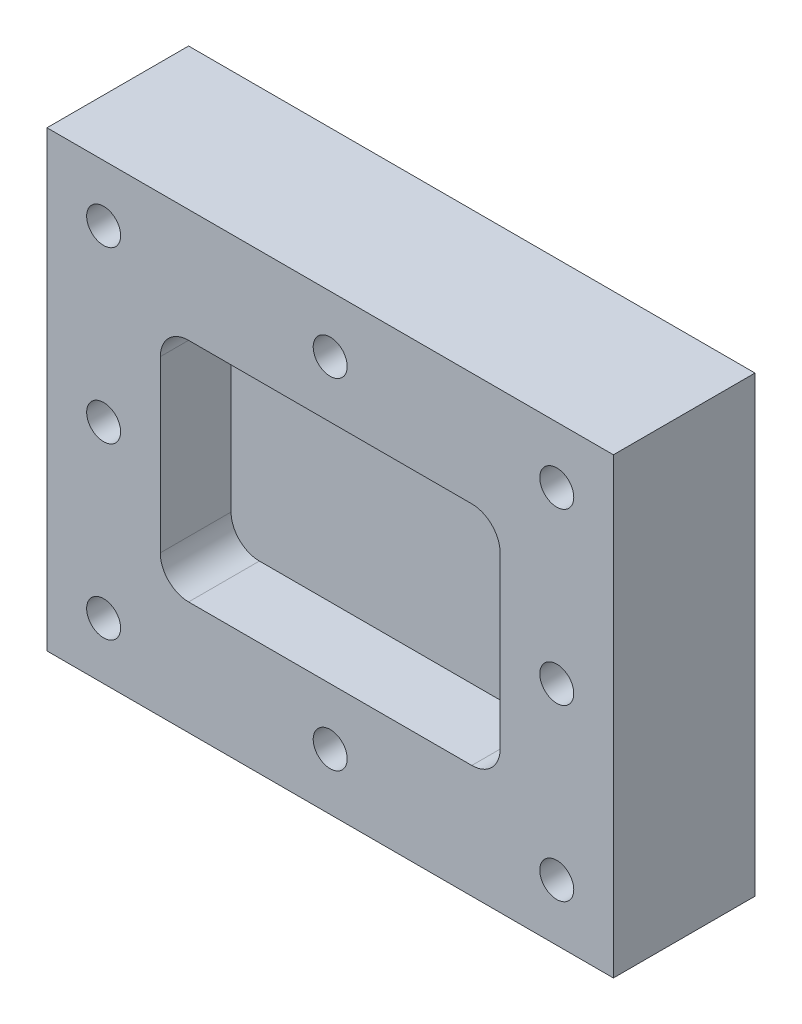
ISO-10303-21;
HEADER;
FILE_DESCRIPTION(('STEP AP214'),'2;1');
FILE_NAME('part.step','',(''),(''),'','','');
FILE_SCHEMA(('AUTOMOTIVE_DESIGN { 1 0 10303 214 1 1 1 1 }'));
ENDSEC;
DATA;
#1=APPLICATION_CONTEXT('core data for automotive mechanical design processes');
#2=APPLICATION_PROTOCOL_DEFINITION('international standard','automotive_design',2000,#1);
#3=PRODUCT_CONTEXT('',#1,'mechanical');
#4=PRODUCT('Part','Part','',(#3));
#5=PRODUCT_RELATED_PRODUCT_CATEGORY('part','',(#4));
#6=PRODUCT_DEFINITION_FORMATION('','',#4);
#7=PRODUCT_DEFINITION_CONTEXT('part definition',#1,'design');
#8=PRODUCT_DEFINITION('design','',#6,#7);
#9=PRODUCT_DEFINITION_SHAPE('','',#8);
#10=(LENGTH_UNIT() NAMED_UNIT(*) SI_UNIT(.MILLI.,.METRE.));
#11=(NAMED_UNIT(*) PLANE_ANGLE_UNIT() SI_UNIT($,.RADIAN.));
#12=(NAMED_UNIT(*) SI_UNIT($,.STERADIAN.) SOLID_ANGLE_UNIT());
#13=UNCERTAINTY_MEASURE_WITH_UNIT(LENGTH_MEASURE(1.E-05),#10,'distance_accuracy_value','');
#14=(GEOMETRIC_REPRESENTATION_CONTEXT(3) GLOBAL_UNCERTAINTY_ASSIGNED_CONTEXT((#13)) GLOBAL_UNIT_ASSIGNED_CONTEXT((#10,
#11,#12)) REPRESENTATION_CONTEXT('',''));
#15=CARTESIAN_POINT('',(0.,0.,0.));
#16=DIRECTION('',(0.,0.,1.));
#17=DIRECTION('',(1.,0.,0.));
#18=AXIS2_PLACEMENT_3D('',#15,#16,#17);
#19=CARTESIAN_POINT('',(-100.,-80.,0.));
#20=DIRECTION('',(0.,0.,-1.));
#21=DIRECTION('',(-1.,0.,0.));
#22=AXIS2_PLACEMENT_3D('',#19,#20,#21);
#23=PLANE('',#22);
#24=CARTESIAN_POINT('',(0.,60.,0.));
#25=DIRECTION('',(0.,0.,1.));
#26=DIRECTION('',(1.,0.,0.));
#27=AXIS2_PLACEMENT_3D('',#24,#25,#26);
#28=CIRCLE('',#27,6.);
#29=CARTESIAN_POINT('',(6.,60.,0.));
#30=VERTEX_POINT('',#29);
#31=EDGE_CURVE('E322',#30,#30,#28,.T.);
#32=ORIENTED_EDGE('',*,*,#31,.F.);
#33=EDGE_LOOP('',(#32));
#34=FACE_BOUND('',#33,.T.);
#35=CARTESIAN_POINT('',(0.,-60.,0.));
#36=DIRECTION('',(0.,0.,1.));
#37=DIRECTION('',(1.,0.,0.));
#38=AXIS2_PLACEMENT_3D('',#35,#36,#37);
#39=CIRCLE('',#38,6.);
#40=CARTESIAN_POINT('',(6.,-60.,0.));
#41=VERTEX_POINT('',#40);
#42=EDGE_CURVE('E318',#41,#41,#39,.T.);
#43=ORIENTED_EDGE('',*,*,#42,.F.);
#44=EDGE_LOOP('',(#43));
#45=FACE_BOUND('',#44,.T.);
#46=CARTESIAN_POINT('',(80.0000000000001,60.,0.));
#47=DIRECTION('',(0.,0.,1.));
#48=DIRECTION('',(1.,0.,0.));
#49=AXIS2_PLACEMENT_3D('',#46,#47,#48);
#50=CIRCLE('',#49,6.);
#51=CARTESIAN_POINT('',(86.0000000000001,60.,0.));
#52=VERTEX_POINT('',#51);
#53=EDGE_CURVE('E314',#52,#52,#50,.T.);
#54=ORIENTED_EDGE('',*,*,#53,.F.);
#55=EDGE_LOOP('',(#54));
#56=FACE_BOUND('',#55,.T.);
#57=CARTESIAN_POINT('',(80.,0.,0.));
#58=DIRECTION('',(0.,0.,1.));
#59=DIRECTION('',(1.,0.,0.));
#60=AXIS2_PLACEMENT_3D('',#57,#58,#59);
#61=CIRCLE('',#60,6.);
#62=CARTESIAN_POINT('',(86.,0.,0.));
#63=VERTEX_POINT('',#62);
#64=EDGE_CURVE('E310',#63,#63,#61,.T.);
#65=ORIENTED_EDGE('',*,*,#64,.F.);
#66=EDGE_LOOP('',(#65));
#67=FACE_BOUND('',#66,.T.);
#68=CARTESIAN_POINT('',(80.,-60.,0.));
#69=DIRECTION('',(0.,0.,1.));
#70=DIRECTION('',(1.,0.,0.));
#71=AXIS2_PLACEMENT_3D('',#68,#69,#70);
#72=CIRCLE('',#71,6.);
#73=CARTESIAN_POINT('',(86.,-60.,0.));
#74=VERTEX_POINT('',#73);
#75=EDGE_CURVE('E306',#74,#74,#72,.T.);
#76=ORIENTED_EDGE('',*,*,#75,.F.);
#77=EDGE_LOOP('',(#76));
#78=FACE_BOUND('',#77,.T.);
#79=CARTESIAN_POINT('',(-80.,-60.,0.));
#80=DIRECTION('',(0.,0.,1.));
#81=DIRECTION('',(1.,0.,0.));
#82=AXIS2_PLACEMENT_3D('',#79,#80,#81);
#83=CIRCLE('',#82,6.);
#84=CARTESIAN_POINT('',(-74.,-60.,0.));
#85=VERTEX_POINT('',#84);
#86=EDGE_CURVE('E302',#85,#85,#83,.T.);
#87=ORIENTED_EDGE('',*,*,#86,.F.);
#88=EDGE_LOOP('',(#87));
#89=FACE_BOUND('',#88,.T.);
#90=CARTESIAN_POINT('',(-80.,0.,0.));
#91=DIRECTION('',(0.,0.,1.));
#92=DIRECTION('',(1.,0.,0.));
#93=AXIS2_PLACEMENT_3D('',#90,#91,#92);
#94=CIRCLE('',#93,6.);
#95=CARTESIAN_POINT('',(-74.,0.,0.));
#96=VERTEX_POINT('',#95);
#97=EDGE_CURVE('E296',#96,#96,#94,.T.);
#98=ORIENTED_EDGE('',*,*,#97,.F.);
#99=EDGE_LOOP('',(#98));
#100=FACE_BOUND('',#99,.T.);
#101=CARTESIAN_POINT('',(-80.,60.,0.));
#102=DIRECTION('',(0.,0.,1.));
#103=DIRECTION('',(1.,0.,0.));
#104=AXIS2_PLACEMENT_3D('',#101,#102,#103);
#105=CIRCLE('',#104,6.);
#106=CARTESIAN_POINT('',(-74.,60.,0.));
#107=VERTEX_POINT('',#106);
#108=EDGE_CURVE('E148',#107,#107,#105,.T.);
#109=ORIENTED_EDGE('',*,*,#108,.F.);
#110=EDGE_LOOP('',(#109));
#111=FACE_BOUND('',#110,.T.);
#112=DIRECTION('',(0.,-1.,0.));
#113=VECTOR('',#112,1.);
#114=CARTESIAN_POINT('',(-100.,80.,0.));
#115=LINE('',#114,#113);
#116=CARTESIAN_POINT('',(-100.,80.,0.));
#117=VERTEX_POINT('',#116);
#118=CARTESIAN_POINT('',(-100.,-80.,0.));
#119=VERTEX_POINT('',#118);
#120=EDGE_CURVE('E139',#117,#119,#115,.T.);
#121=ORIENTED_EDGE('',*,*,#120,.T.);
#122=DIRECTION('',(-1.,0.,0.));
#123=VECTOR('',#122,1.);
#124=CARTESIAN_POINT('',(100.,-80.,0.));
#125=LINE('',#124,#123);
#126=CARTESIAN_POINT('',(100.,-80.,0.));
#127=VERTEX_POINT('',#126);
#128=EDGE_CURVE('E198',#127,#119,#125,.T.);
#129=ORIENTED_EDGE('',*,*,#128,.F.);
#130=DIRECTION('',(0.,1.,0.));
#131=VECTOR('',#130,1.);
#132=CARTESIAN_POINT('',(100.,-80.,0.));
#133=LINE('',#132,#131);
#134=CARTESIAN_POINT('',(100.,80.,0.));
#135=VERTEX_POINT('',#134);
#136=EDGE_CURVE('E201',#127,#135,#133,.T.);
#137=ORIENTED_EDGE('',*,*,#136,.T.);
#138=DIRECTION('',(1.,0.,0.));
#139=VECTOR('',#138,1.);
#140=CARTESIAN_POINT('',(-100.,80.,0.));
#141=LINE('',#140,#139);
#142=EDGE_CURVE('E204',#117,#135,#141,.T.);
#143=ORIENTED_EDGE('',*,*,#142,.F.);
#144=EDGE_LOOP('',(#121,#129,#137,#143));
#145=FACE_BOUND('',#144,.T.);
#146=CARTESIAN_POINT('',(-50.,30.,0.));
#147=DIRECTION('',(0.,0.,-1.));
#148=DIRECTION('',(-1.,0.,0.));
#149=AXIS2_PLACEMENT_3D('',#146,#147,#148);
#150=CIRCLE('',#149,10.);
#151=CARTESIAN_POINT('',(-60.,29.9999999999999,0.));
#152=VERTEX_POINT('',#151);
#153=CARTESIAN_POINT('',(-49.9999999999999,40.,0.));
#154=VERTEX_POINT('',#153);
#155=EDGE_CURVE('E51',#152,#154,#150,.T.);
#156=ORIENTED_EDGE('',*,*,#155,.T.);
#157=DIRECTION('',(1.,0.,0.));
#158=VECTOR('',#157,1.);
#159=CARTESIAN_POINT('',(-49.9999999999999,40.,0.));
#160=LINE('',#159,#158);
#161=CARTESIAN_POINT('',(49.9999999999999,40.,0.));
#162=VERTEX_POINT('',#161);
#163=EDGE_CURVE('E125',#154,#162,#160,.T.);
#164=ORIENTED_EDGE('',*,*,#163,.T.);
#165=CARTESIAN_POINT('',(50.,30.,0.));
#166=DIRECTION('',(0.,0.,1.));
#167=DIRECTION('',(1.,0.,0.));
#168=AXIS2_PLACEMENT_3D('',#165,#166,#167);
#169=CIRCLE('',#168,10.);
#170=CARTESIAN_POINT('',(60.,29.9999999999999,0.));
#171=VERTEX_POINT('',#170);
#172=EDGE_CURVE('E133',#171,#162,#169,.T.);
#173=ORIENTED_EDGE('',*,*,#172,.F.);
#174=DIRECTION('',(0.,1.,0.));
#175=VECTOR('',#174,1.);
#176=CARTESIAN_POINT('',(60.,-29.9999999999999,0.));
#177=LINE('',#176,#175);
#178=CARTESIAN_POINT('',(60.,-29.9999999999999,0.));
#179=VERTEX_POINT('',#178);
#180=EDGE_CURVE('E153',#179,#171,#177,.T.);
#181=ORIENTED_EDGE('',*,*,#180,.F.);
#182=CARTESIAN_POINT('',(50.,-30.,0.));
#183=DIRECTION('',(0.,0.,-1.));
#184=DIRECTION('',(-1.,0.,0.));
#185=AXIS2_PLACEMENT_3D('',#182,#183,#184);
#186=CIRCLE('',#185,10.);
#187=CARTESIAN_POINT('',(49.9999999999999,-40.,0.));
#188=VERTEX_POINT('',#187);
#189=EDGE_CURVE('E156',#179,#188,#186,.T.);
#190=ORIENTED_EDGE('',*,*,#189,.T.);
#191=DIRECTION('',(-1.,0.,0.));
#192=VECTOR('',#191,1.);
#193=CARTESIAN_POINT('',(49.9999999999999,-40.,0.));
#194=LINE('',#193,#192);
#195=CARTESIAN_POINT('',(-49.9999999999999,-40.,0.));
#196=VERTEX_POINT('',#195);
#197=EDGE_CURVE('E159',#188,#196,#194,.T.);
#198=ORIENTED_EDGE('',*,*,#197,.T.);
#199=CARTESIAN_POINT('',(-50.,-30.,0.));
#200=DIRECTION('',(0.,0.,-1.));
#201=DIRECTION('',(-1.,0.,0.));
#202=AXIS2_PLACEMENT_3D('',#199,#200,#201);
#203=CIRCLE('',#202,10.);
#204=CARTESIAN_POINT('',(-60.,-29.9999999999999,0.));
#205=VERTEX_POINT('',#204);
#206=EDGE_CURVE('E162',#196,#205,#203,.T.);
#207=ORIENTED_EDGE('',*,*,#206,.T.);
#208=DIRECTION('',(0.,-1.,0.));
#209=VECTOR('',#208,1.);
#210=CARTESIAN_POINT('',(-60.,29.9999999999999,0.));
#211=LINE('',#210,#209);
#212=EDGE_CURVE('E144',#152,#205,#211,.T.);
#213=ORIENTED_EDGE('',*,*,#212,.F.);
#214=EDGE_LOOP('',(#156,#164,#173,#181,#190,#198,#207,#213));
#215=FACE_BOUND('',#214,.T.);
#216=ADVANCED_FACE('F34',(#34,#45,#56,#67,#78,#89,#100,#111,#145,#215),#23,.F.);
#217=CARTESIAN_POINT('',(-100.,80.,-50.));
#218=DIRECTION('',(-1.,0.,0.));
#219=DIRECTION('',(0.,0.,1.));
#220=AXIS2_PLACEMENT_3D('',#217,#218,#219);
#221=PLANE('',#220);
#222=ORIENTED_EDGE('',*,*,#120,.F.);
#223=DIRECTION('',(0.,0.,1.));
#224=VECTOR('',#223,1.);
#225=CARTESIAN_POINT('',(-100.,80.,-50.));
#226=LINE('',#225,#224);
#227=CARTESIAN_POINT('',(-100.,80.,-50.));
#228=VERTEX_POINT('',#227);
#229=EDGE_CURVE('E11',#228,#117,#226,.T.);
#230=ORIENTED_EDGE('',*,*,#229,.F.);
#231=DIRECTION('',(0.,-1.,0.));
#232=VECTOR('',#231,1.);
#233=CARTESIAN_POINT('',(-100.,80.,-50.));
#234=LINE('',#233,#232);
#235=CARTESIAN_POINT('',(-100.,-80.,-50.));
#236=VERTEX_POINT('',#235);
#237=EDGE_CURVE('E207',#228,#236,#234,.T.);
#238=ORIENTED_EDGE('',*,*,#237,.T.);
#239=DIRECTION('',(0.,0.,1.));
#240=VECTOR('',#239,1.);
#241=CARTESIAN_POINT('',(-100.,-80.,-50.));
#242=LINE('',#241,#240);
#243=EDGE_CURVE('E38',#236,#119,#242,.T.);
#244=ORIENTED_EDGE('',*,*,#243,.T.);
#245=EDGE_LOOP('',(#222,#230,#238,#244));
#246=FACE_BOUND('',#245,.T.);
#247=ADVANCED_FACE('F36',(#246),#221,.T.);
#248=CARTESIAN_POINT('',(-100.,80.,-50.));
#249=DIRECTION('',(0.,-1.,0.));
#250=DIRECTION('',(0.,0.,-1.));
#251=AXIS2_PLACEMENT_3D('',#248,#249,#250);
#252=PLANE('',#251);
#253=ORIENTED_EDGE('',*,*,#142,.T.);
#254=DIRECTION('',(0.,0.,1.));
#255=VECTOR('',#254,1.);
#256=CARTESIAN_POINT('',(100.,80.,-50.));
#257=LINE('',#256,#255);
#258=CARTESIAN_POINT('',(100.,80.,-50.));
#259=VERTEX_POINT('',#258);
#260=EDGE_CURVE('E43',#259,#135,#257,.T.);
#261=ORIENTED_EDGE('',*,*,#260,.F.);
#262=DIRECTION('',(1.,0.,0.));
#263=VECTOR('',#262,1.);
#264=CARTESIAN_POINT('',(-100.,80.,-50.));
#265=LINE('',#264,#263);
#266=EDGE_CURVE('E214',#228,#259,#265,.T.);
#267=ORIENTED_EDGE('',*,*,#266,.F.);
#268=ORIENTED_EDGE('',*,*,#229,.T.);
#269=EDGE_LOOP('',(#253,#261,#267,#268));
#270=FACE_BOUND('',#269,.T.);
#271=ADVANCED_FACE('F228',(#270),#252,.F.);
#272=CARTESIAN_POINT('',(100.,-80.,-50.));
#273=DIRECTION('',(1.,0.,0.));
#274=DIRECTION('',(0.,0.,-1.));
#275=AXIS2_PLACEMENT_3D('',#272,#273,#274);
#276=PLANE('',#275);
#277=ORIENTED_EDGE('',*,*,#136,.F.);
#278=DIRECTION('',(0.,0.,1.));
#279=VECTOR('',#278,1.);
#280=CARTESIAN_POINT('',(100.,-80.,-50.));
#281=LINE('',#280,#279);
#282=CARTESIAN_POINT('',(100.,-80.,-50.));
#283=VERTEX_POINT('',#282);
#284=EDGE_CURVE('E216',#283,#127,#281,.T.);
#285=ORIENTED_EDGE('',*,*,#284,.F.);
#286=DIRECTION('',(0.,1.,0.));
#287=VECTOR('',#286,1.);
#288=CARTESIAN_POINT('',(100.,-80.,-50.));
#289=LINE('',#288,#287);
#290=EDGE_CURVE('E211',#283,#259,#289,.T.);
#291=ORIENTED_EDGE('',*,*,#290,.T.);
#292=ORIENTED_EDGE('',*,*,#260,.T.);
#293=EDGE_LOOP('',(#277,#285,#291,#292));
#294=FACE_BOUND('',#293,.T.);
#295=ADVANCED_FACE('F233',(#294),#276,.T.);
#296=CARTESIAN_POINT('',(100.,-80.,-50.));
#297=DIRECTION('',(0.,1.,0.));
#298=DIRECTION('',(0.,0.,1.));
#299=AXIS2_PLACEMENT_3D('',#296,#297,#298);
#300=PLANE('',#299);
#301=ORIENTED_EDGE('',*,*,#128,.T.);
#302=ORIENTED_EDGE('',*,*,#243,.F.);
#303=DIRECTION('',(-1.,0.,0.));
#304=VECTOR('',#303,1.);
#305=CARTESIAN_POINT('',(100.,-80.,-50.));
#306=LINE('',#305,#304);
#307=EDGE_CURVE('E209',#283,#236,#306,.T.);
#308=ORIENTED_EDGE('',*,*,#307,.F.);
#309=ORIENTED_EDGE('',*,*,#284,.T.);
#310=EDGE_LOOP('',(#301,#302,#308,#309));
#311=FACE_BOUND('',#310,.T.);
#312=ADVANCED_FACE('F222',(#311),#300,.F.);
#313=CARTESIAN_POINT('',(-100.,-80.,-50.));
#314=DIRECTION('',(0.,0.,-1.));
#315=DIRECTION('',(-1.,0.,0.));
#316=AXIS2_PLACEMENT_3D('',#313,#314,#315);
#317=PLANE('',#316);
#318=CARTESIAN_POINT('',(0.,60.,-50.));
#319=DIRECTION('',(0.,0.,1.));
#320=DIRECTION('',(1.,0.,0.));
#321=AXIS2_PLACEMENT_3D('',#318,#319,#320);
#322=CIRCLE('',#321,6.);
#323=CARTESIAN_POINT('',(6.,60.,-50.));
#324=VERTEX_POINT('',#323);
#325=EDGE_CURVE('E260',#324,#324,#322,.T.);
#326=ORIENTED_EDGE('',*,*,#325,.T.);
#327=EDGE_LOOP('',(#326));
#328=FACE_BOUND('',#327,.T.);
#329=CARTESIAN_POINT('',(0.,-60.,-50.));
#330=DIRECTION('',(0.,0.,1.));
#331=DIRECTION('',(1.,0.,0.));
#332=AXIS2_PLACEMENT_3D('',#329,#330,#331);
#333=CIRCLE('',#332,6.);
#334=CARTESIAN_POINT('',(6.,-60.,-50.));
#335=VERTEX_POINT('',#334);
#336=EDGE_CURVE('E264',#335,#335,#333,.T.);
#337=ORIENTED_EDGE('',*,*,#336,.T.);
#338=EDGE_LOOP('',(#337));
#339=FACE_BOUND('',#338,.T.);
#340=CARTESIAN_POINT('',(80.0000000000001,60.,-50.));
#341=DIRECTION('',(0.,0.,1.));
#342=DIRECTION('',(1.,0.,0.));
#343=AXIS2_PLACEMENT_3D('',#340,#341,#342);
#344=CIRCLE('',#343,6.);
#345=CARTESIAN_POINT('',(86.0000000000001,60.,-50.));
#346=VERTEX_POINT('',#345);
#347=EDGE_CURVE('E268',#346,#346,#344,.T.);
#348=ORIENTED_EDGE('',*,*,#347,.T.);
#349=EDGE_LOOP('',(#348));
#350=FACE_BOUND('',#349,.T.);
#351=CARTESIAN_POINT('',(80.,0.,-50.));
#352=DIRECTION('',(0.,0.,1.));
#353=DIRECTION('',(1.,0.,0.));
#354=AXIS2_PLACEMENT_3D('',#351,#352,#353);
#355=CIRCLE('',#354,6.);
#356=CARTESIAN_POINT('',(86.,0.,-50.));
#357=VERTEX_POINT('',#356);
#358=EDGE_CURVE('E272',#357,#357,#355,.T.);
#359=ORIENTED_EDGE('',*,*,#358,.T.);
#360=EDGE_LOOP('',(#359));
#361=FACE_BOUND('',#360,.T.);
#362=CARTESIAN_POINT('',(80.,-60.,-50.));
#363=DIRECTION('',(0.,0.,1.));
#364=DIRECTION('',(1.,0.,0.));
#365=AXIS2_PLACEMENT_3D('',#362,#363,#364);
#366=CIRCLE('',#365,6.);
#367=CARTESIAN_POINT('',(86.,-60.,-50.));
#368=VERTEX_POINT('',#367);
#369=EDGE_CURVE('E276',#368,#368,#366,.T.);
#370=ORIENTED_EDGE('',*,*,#369,.T.);
#371=EDGE_LOOP('',(#370));
#372=FACE_BOUND('',#371,.T.);
#373=CARTESIAN_POINT('',(-80.,-60.,-50.));
#374=DIRECTION('',(0.,0.,1.));
#375=DIRECTION('',(1.,0.,0.));
#376=AXIS2_PLACEMENT_3D('',#373,#374,#375);
#377=CIRCLE('',#376,6.);
#378=CARTESIAN_POINT('',(-74.,-60.,-50.));
#379=VERTEX_POINT('',#378);
#380=EDGE_CURVE('E280',#379,#379,#377,.T.);
#381=ORIENTED_EDGE('',*,*,#380,.T.);
#382=EDGE_LOOP('',(#381));
#383=FACE_BOUND('',#382,.T.);
#384=CARTESIAN_POINT('',(-80.,0.,-50.));
#385=DIRECTION('',(0.,0.,1.));
#386=DIRECTION('',(1.,0.,0.));
#387=AXIS2_PLACEMENT_3D('',#384,#385,#386);
#388=CIRCLE('',#387,6.);
#389=CARTESIAN_POINT('',(-74.,0.,-50.));
#390=VERTEX_POINT('',#389);
#391=EDGE_CURVE('E284',#390,#390,#388,.T.);
#392=ORIENTED_EDGE('',*,*,#391,.T.);
#393=EDGE_LOOP('',(#392));
#394=FACE_BOUND('',#393,.T.);
#395=CARTESIAN_POINT('',(-80.,60.,-50.));
#396=DIRECTION('',(0.,0.,1.));
#397=DIRECTION('',(1.,0.,0.));
#398=AXIS2_PLACEMENT_3D('',#395,#396,#397);
#399=CIRCLE('',#398,6.);
#400=CARTESIAN_POINT('',(-74.,60.,-50.));
#401=VERTEX_POINT('',#400);
#402=EDGE_CURVE('E145',#401,#401,#399,.T.);
#403=ORIENTED_EDGE('',*,*,#402,.T.);
#404=EDGE_LOOP('',(#403));
#405=FACE_BOUND('',#404,.T.);
#406=ORIENTED_EDGE('',*,*,#237,.F.);
#407=ORIENTED_EDGE('',*,*,#266,.T.);
#408=ORIENTED_EDGE('',*,*,#290,.F.);
#409=ORIENTED_EDGE('',*,*,#307,.T.);
#410=EDGE_LOOP('',(#406,#407,#408,#409));
#411=FACE_BOUND('',#410,.T.);
#412=ADVANCED_FACE('F231',(#328,#339,#350,#361,#372,#383,#394,#405,#411),#317,.T.);
#413=CARTESIAN_POINT('',(-50.,30.,-25.));
#414=DIRECTION('',(0.,0.,1.));
#415=DIRECTION('',(1.,0.,0.));
#416=AXIS2_PLACEMENT_3D('',#413,#414,#415);
#417=CYLINDRICAL_SURFACE('',#416,10.);
#418=ORIENTED_EDGE('',*,*,#155,.F.);
#419=DIRECTION('',(0.,0.,1.));
#420=VECTOR('',#419,1.);
#421=CARTESIAN_POINT('',(-60.,29.9999999999999,-25.));
#422=LINE('',#421,#420);
#423=CARTESIAN_POINT('',(-60.,29.9999999999999,-25.));
#424=VERTEX_POINT('',#423);
#425=EDGE_CURVE('E183',#424,#152,#422,.T.);
#426=ORIENTED_EDGE('',*,*,#425,.F.);
#427=CARTESIAN_POINT('',(-50.,30.,-25.));
#428=DIRECTION('',(0.,0.,-1.));
#429=DIRECTION('',(-1.,0.,0.));
#430=AXIS2_PLACEMENT_3D('',#427,#428,#429);
#431=CIRCLE('',#430,10.);
#432=CARTESIAN_POINT('',(-49.9999999999999,40.,-25.));
#433=VERTEX_POINT('',#432);
#434=EDGE_CURVE('E138',#424,#433,#431,.T.);
#435=ORIENTED_EDGE('',*,*,#434,.T.);
#436=DIRECTION('',(0.,0.,1.));
#437=VECTOR('',#436,1.);
#438=CARTESIAN_POINT('',(-49.9999999999999,40.,-25.));
#439=LINE('',#438,#437);
#440=EDGE_CURVE('E127',#433,#154,#439,.T.);
#441=ORIENTED_EDGE('',*,*,#440,.T.);
#442=EDGE_LOOP('',(#418,#426,#435,#441));
#443=FACE_BOUND('',#442,.T.);
#444=ADVANCED_FACE('F136',(#443),#417,.F.);
#445=CARTESIAN_POINT('',(-49.9999999999999,40.,-25.));
#446=DIRECTION('',(0.,-1.,0.));
#447=DIRECTION('',(0.,0.,-1.));
#448=AXIS2_PLACEMENT_3D('',#445,#446,#447);
#449=PLANE('',#448);
#450=ORIENTED_EDGE('',*,*,#163,.F.);
#451=ORIENTED_EDGE('',*,*,#440,.F.);
#452=DIRECTION('',(1.,0.,0.));
#453=VECTOR('',#452,1.);
#454=CARTESIAN_POINT('',(-49.9999999999999,40.,-25.));
#455=LINE('',#454,#453);
#456=CARTESIAN_POINT('',(49.9999999999999,40.,-25.));
#457=VERTEX_POINT('',#456);
#458=EDGE_CURVE('E166',#433,#457,#455,.T.);
#459=ORIENTED_EDGE('',*,*,#458,.T.);
#460=DIRECTION('',(0.,0.,1.));
#461=VECTOR('',#460,1.);
#462=CARTESIAN_POINT('',(49.9999999999999,40.,-25.));
#463=LINE('',#462,#461);
#464=EDGE_CURVE('E129',#457,#162,#463,.T.);
#465=ORIENTED_EDGE('',*,*,#464,.T.);
#466=EDGE_LOOP('',(#450,#451,#459,#465));
#467=FACE_BOUND('',#466,.T.);
#468=ADVANCED_FACE('F126',(#467),#449,.T.);
#469=CARTESIAN_POINT('',(50.,30.,-25.));
#470=DIRECTION('',(0.,0.,1.));
#471=DIRECTION('',(1.,0.,0.));
#472=AXIS2_PLACEMENT_3D('',#469,#470,#471);
#473=CYLINDRICAL_SURFACE('',#472,10.);
#474=ORIENTED_EDGE('',*,*,#172,.T.);
#475=ORIENTED_EDGE('',*,*,#464,.F.);
#476=CARTESIAN_POINT('',(50.,30.,-25.));
#477=DIRECTION('',(0.,0.,1.));
#478=DIRECTION('',(1.,0.,0.));
#479=AXIS2_PLACEMENT_3D('',#476,#477,#478);
#480=CIRCLE('',#479,10.);
#481=CARTESIAN_POINT('',(60.,29.9999999999999,-25.));
#482=VERTEX_POINT('',#481);
#483=EDGE_CURVE('E168',#482,#457,#480,.T.);
#484=ORIENTED_EDGE('',*,*,#483,.F.);
#485=DIRECTION('',(0.,0.,1.));
#486=VECTOR('',#485,1.);
#487=CARTESIAN_POINT('',(60.,29.9999999999999,-25.));
#488=LINE('',#487,#486);
#489=EDGE_CURVE('E193',#482,#171,#488,.T.);
#490=ORIENTED_EDGE('',*,*,#489,.T.);
#491=EDGE_LOOP('',(#474,#475,#484,#490));
#492=FACE_BOUND('',#491,.T.);
#493=ADVANCED_FACE('F377',(#492),#473,.F.);
#494=CARTESIAN_POINT('',(60.,-29.9999999999999,-25.));
#495=DIRECTION('',(1.,0.,0.));
#496=DIRECTION('',(0.,0.,-1.));
#497=AXIS2_PLACEMENT_3D('',#494,#495,#496);
#498=PLANE('',#497);
#499=ORIENTED_EDGE('',*,*,#180,.T.);
#500=ORIENTED_EDGE('',*,*,#489,.F.);
#501=DIRECTION('',(0.,1.,0.));
#502=VECTOR('',#501,1.);
#503=CARTESIAN_POINT('',(60.,-29.9999999999999,-25.));
#504=LINE('',#503,#502);
#505=CARTESIAN_POINT('',(60.,-29.9999999999999,-25.));
#506=VERTEX_POINT('',#505);
#507=EDGE_CURVE('E171',#506,#482,#504,.T.);
#508=ORIENTED_EDGE('',*,*,#507,.F.);
#509=DIRECTION('',(0.,0.,1.));
#510=VECTOR('',#509,1.);
#511=CARTESIAN_POINT('',(60.,-29.9999999999999,-25.));
#512=LINE('',#511,#510);
#513=EDGE_CURVE('E191',#506,#179,#512,.T.);
#514=ORIENTED_EDGE('',*,*,#513,.T.);
#515=EDGE_LOOP('',(#499,#500,#508,#514));
#516=FACE_BOUND('',#515,.T.);
#517=ADVANCED_FACE('F373',(#516),#498,.F.);
#518=CARTESIAN_POINT('',(50.,-30.,-25.));
#519=DIRECTION('',(0.,0.,1.));
#520=DIRECTION('',(1.,0.,0.));
#521=AXIS2_PLACEMENT_3D('',#518,#519,#520);
#522=CYLINDRICAL_SURFACE('',#521,10.);
#523=ORIENTED_EDGE('',*,*,#189,.F.);
#524=ORIENTED_EDGE('',*,*,#513,.F.);
#525=CARTESIAN_POINT('',(50.,-30.,-25.));
#526=DIRECTION('',(0.,0.,-1.));
#527=DIRECTION('',(-1.,0.,0.));
#528=AXIS2_PLACEMENT_3D('',#525,#526,#527);
#529=CIRCLE('',#528,10.);
#530=CARTESIAN_POINT('',(49.9999999999999,-40.,-25.));
#531=VERTEX_POINT('',#530);
#532=EDGE_CURVE('E174',#506,#531,#529,.T.);
#533=ORIENTED_EDGE('',*,*,#532,.T.);
#534=DIRECTION('',(0.,0.,1.));
#535=VECTOR('',#534,1.);
#536=CARTESIAN_POINT('',(49.9999999999999,-40.,-25.));
#537=LINE('',#536,#535);
#538=EDGE_CURVE('E189',#531,#188,#537,.T.);
#539=ORIENTED_EDGE('',*,*,#538,.T.);
#540=EDGE_LOOP('',(#523,#524,#533,#539));
#541=FACE_BOUND('',#540,.T.);
#542=ADVANCED_FACE('F369',(#541),#522,.F.);
#543=CARTESIAN_POINT('',(49.9999999999999,-40.,-25.));
#544=DIRECTION('',(0.,1.,0.));
#545=DIRECTION('',(0.,0.,1.));
#546=AXIS2_PLACEMENT_3D('',#543,#544,#545);
#547=PLANE('',#546);
#548=ORIENTED_EDGE('',*,*,#197,.F.);
#549=ORIENTED_EDGE('',*,*,#538,.F.);
#550=DIRECTION('',(-1.,0.,0.));
#551=VECTOR('',#550,1.);
#552=CARTESIAN_POINT('',(49.9999999999999,-40.,-25.));
#553=LINE('',#552,#551);
#554=CARTESIAN_POINT('',(-49.9999999999999,-40.,-25.));
#555=VERTEX_POINT('',#554);
#556=EDGE_CURVE('E176',#531,#555,#553,.T.);
#557=ORIENTED_EDGE('',*,*,#556,.T.);
#558=DIRECTION('',(0.,0.,1.));
#559=VECTOR('',#558,1.);
#560=CARTESIAN_POINT('',(-49.9999999999999,-40.,-25.));
#561=LINE('',#560,#559);
#562=EDGE_CURVE('E187',#555,#196,#561,.T.);
#563=ORIENTED_EDGE('',*,*,#562,.T.);
#564=EDGE_LOOP('',(#548,#549,#557,#563));
#565=FACE_BOUND('',#564,.T.);
#566=ADVANCED_FACE('F365',(#565),#547,.T.);
#567=CARTESIAN_POINT('',(-50.,-30.,-25.));
#568=DIRECTION('',(0.,0.,1.));
#569=DIRECTION('',(1.,0.,0.));
#570=AXIS2_PLACEMENT_3D('',#567,#568,#569);
#571=CYLINDRICAL_SURFACE('',#570,10.);
#572=ORIENTED_EDGE('',*,*,#206,.F.);
#573=ORIENTED_EDGE('',*,*,#562,.F.);
#574=CARTESIAN_POINT('',(-50.,-30.,-25.));
#575=DIRECTION('',(0.,0.,-1.));
#576=DIRECTION('',(-1.,0.,0.));
#577=AXIS2_PLACEMENT_3D('',#574,#575,#576);
#578=CIRCLE('',#577,10.);
#579=CARTESIAN_POINT('',(-60.,-29.9999999999999,-25.));
#580=VERTEX_POINT('',#579);
#581=EDGE_CURVE('E178',#555,#580,#578,.T.);
#582=ORIENTED_EDGE('',*,*,#581,.T.);
#583=DIRECTION('',(0.,0.,1.));
#584=VECTOR('',#583,1.);
#585=CARTESIAN_POINT('',(-60.,-29.9999999999999,-25.));
#586=LINE('',#585,#584);
#587=EDGE_CURVE('E185',#580,#205,#586,.T.);
#588=ORIENTED_EDGE('',*,*,#587,.T.);
#589=EDGE_LOOP('',(#572,#573,#582,#588));
#590=FACE_BOUND('',#589,.T.);
#591=ADVANCED_FACE('F361',(#590),#571,.F.);
#592=CARTESIAN_POINT('',(-60.,29.9999999999999,-25.));
#593=DIRECTION('',(-1.,0.,0.));
#594=DIRECTION('',(0.,0.,1.));
#595=AXIS2_PLACEMENT_3D('',#592,#593,#594);
#596=PLANE('',#595);
#597=ORIENTED_EDGE('',*,*,#212,.T.);
#598=ORIENTED_EDGE('',*,*,#587,.F.);
#599=DIRECTION('',(0.,-1.,0.));
#600=VECTOR('',#599,1.);
#601=CARTESIAN_POINT('',(-60.,29.9999999999999,-25.));
#602=LINE('',#601,#600);
#603=EDGE_CURVE('E180',#424,#580,#602,.T.);
#604=ORIENTED_EDGE('',*,*,#603,.F.);
#605=ORIENTED_EDGE('',*,*,#425,.T.);
#606=EDGE_LOOP('',(#597,#598,#604,#605));
#607=FACE_BOUND('',#606,.T.);
#608=ADVANCED_FACE('F357',(#607),#596,.F.);
#609=CARTESIAN_POINT('',(-50.,30.,-25.));
#610=DIRECTION('',(0.,0.,-1.));
#611=DIRECTION('',(-1.,0.,0.));
#612=AXIS2_PLACEMENT_3D('',#609,#610,#611);
#613=PLANE('',#612);
#614=ORIENTED_EDGE('',*,*,#434,.F.);
#615=ORIENTED_EDGE('',*,*,#603,.T.);
#616=ORIENTED_EDGE('',*,*,#581,.F.);
#617=ORIENTED_EDGE('',*,*,#556,.F.);
#618=ORIENTED_EDGE('',*,*,#532,.F.);
#619=ORIENTED_EDGE('',*,*,#507,.T.);
#620=ORIENTED_EDGE('',*,*,#483,.T.);
#621=ORIENTED_EDGE('',*,*,#458,.F.);
#622=EDGE_LOOP('',(#614,#615,#616,#617,#618,#619,#620,#621));
#623=FACE_BOUND('',#622,.T.);
#624=ADVANCED_FACE('F291',(#623),#613,.F.);
#625=CARTESIAN_POINT('',(-80.,60.,-50.));
#626=DIRECTION('',(0.,0.,1.));
#627=DIRECTION('',(1.,0.,0.));
#628=AXIS2_PLACEMENT_3D('',#625,#626,#627);
#629=CYLINDRICAL_SURFACE('',#628,6.);
#630=ORIENTED_EDGE('',*,*,#402,.F.);
#631=EDGE_LOOP('',(#630));
#632=FACE_BOUND('',#631,.T.);
#633=ORIENTED_EDGE('',*,*,#108,.T.);
#634=EDGE_LOOP('',(#633));
#635=FACE_BOUND('',#634,.T.);
#636=ADVANCED_FACE('F287',(#632,#635),#629,.F.);
#637=CARTESIAN_POINT('',(-80.,0.,-50.));
#638=DIRECTION('',(0.,0.,1.));
#639=DIRECTION('',(1.,0.,0.));
#640=AXIS2_PLACEMENT_3D('',#637,#638,#639);
#641=CYLINDRICAL_SURFACE('',#640,6.);
#642=ORIENTED_EDGE('',*,*,#391,.F.);
#643=EDGE_LOOP('',(#642));
#644=FACE_BOUND('',#643,.T.);
#645=ORIENTED_EDGE('',*,*,#97,.T.);
#646=EDGE_LOOP('',(#645));
#647=FACE_BOUND('',#646,.T.);
#648=ADVANCED_FACE('F290',(#644,#647),#641,.F.);
#649=CARTESIAN_POINT('',(-80.,-60.,-50.));
#650=DIRECTION('',(0.,0.,1.));
#651=DIRECTION('',(1.,0.,0.));
#652=AXIS2_PLACEMENT_3D('',#649,#650,#651);
#653=CYLINDRICAL_SURFACE('',#652,6.);
#654=ORIENTED_EDGE('',*,*,#380,.F.);
#655=EDGE_LOOP('',(#654));
#656=FACE_BOUND('',#655,.T.);
#657=ORIENTED_EDGE('',*,*,#86,.T.);
#658=EDGE_LOOP('',(#657));
#659=FACE_BOUND('',#658,.T.);
#660=ADVANCED_FACE('F347',(#656,#659),#653,.F.);
#661=CARTESIAN_POINT('',(80.,-60.,-50.));
#662=DIRECTION('',(0.,0.,1.));
#663=DIRECTION('',(1.,0.,0.));
#664=AXIS2_PLACEMENT_3D('',#661,#662,#663);
#665=CYLINDRICAL_SURFACE('',#664,6.);
#666=ORIENTED_EDGE('',*,*,#369,.F.);
#667=EDGE_LOOP('',(#666));
#668=FACE_BOUND('',#667,.T.);
#669=ORIENTED_EDGE('',*,*,#75,.T.);
#670=EDGE_LOOP('',(#669));
#671=FACE_BOUND('',#670,.T.);
#672=ADVANCED_FACE('F343',(#668,#671),#665,.F.);
#673=CARTESIAN_POINT('',(80.,0.,-50.));
#674=DIRECTION('',(0.,0.,1.));
#675=DIRECTION('',(1.,0.,0.));
#676=AXIS2_PLACEMENT_3D('',#673,#674,#675);
#677=CYLINDRICAL_SURFACE('',#676,6.);
#678=ORIENTED_EDGE('',*,*,#358,.F.);
#679=EDGE_LOOP('',(#678));
#680=FACE_BOUND('',#679,.T.);
#681=ORIENTED_EDGE('',*,*,#64,.T.);
#682=EDGE_LOOP('',(#681));
#683=FACE_BOUND('',#682,.T.);
#684=ADVANCED_FACE('F339',(#680,#683),#677,.F.);
#685=CARTESIAN_POINT('',(80.0000000000001,60.,-50.));
#686=DIRECTION('',(0.,0.,1.));
#687=DIRECTION('',(1.,0.,0.));
#688=AXIS2_PLACEMENT_3D('',#685,#686,#687);
#689=CYLINDRICAL_SURFACE('',#688,6.);
#690=ORIENTED_EDGE('',*,*,#347,.F.);
#691=EDGE_LOOP('',(#690));
#692=FACE_BOUND('',#691,.T.);
#693=ORIENTED_EDGE('',*,*,#53,.T.);
#694=EDGE_LOOP('',(#693));
#695=FACE_BOUND('',#694,.T.);
#696=ADVANCED_FACE('F333',(#692,#695),#689,.F.);
#697=CARTESIAN_POINT('',(0.,-60.,-50.));
#698=DIRECTION('',(0.,0.,1.));
#699=DIRECTION('',(1.,0.,0.));
#700=AXIS2_PLACEMENT_3D('',#697,#698,#699);
#701=CYLINDRICAL_SURFACE('',#700,6.);
#702=ORIENTED_EDGE('',*,*,#336,.F.);
#703=EDGE_LOOP('',(#702));
#704=FACE_BOUND('',#703,.T.);
#705=ORIENTED_EDGE('',*,*,#42,.T.);
#706=EDGE_LOOP('',(#705));
#707=FACE_BOUND('',#706,.T.);
#708=ADVANCED_FACE('F327',(#704,#707),#701,.F.);
#709=CARTESIAN_POINT('',(0.,60.,-50.));
#710=DIRECTION('',(0.,0.,1.));
#711=DIRECTION('',(1.,0.,0.));
#712=AXIS2_PLACEMENT_3D('',#709,#710,#711);
#713=CYLINDRICAL_SURFACE('',#712,6.);
#714=ORIENTED_EDGE('',*,*,#325,.F.);
#715=EDGE_LOOP('',(#714));
#716=FACE_BOUND('',#715,.T.);
#717=ORIENTED_EDGE('',*,*,#31,.T.);
#718=EDGE_LOOP('',(#717));
#719=FACE_BOUND('',#718,.T.);
#720=ADVANCED_FACE('F325',(#716,#719),#713,.F.);
#721=CLOSED_SHELL('',(#216,#247,#271,#295,#312,#412,#444,#468,#493,#517,#542,#566,#591,#608,
#624,#636,#648,#660,#672,#684,#696,#708,#720));
#722=MANIFOLD_SOLID_BREP('B2',#721);
#723=ADVANCED_BREP_SHAPE_REPRESENTATION('',(#18,#722),#14);
#724=SHAPE_DEFINITION_REPRESENTATION(#9,#723);
ENDSEC;
END-ISO-10303-21;
